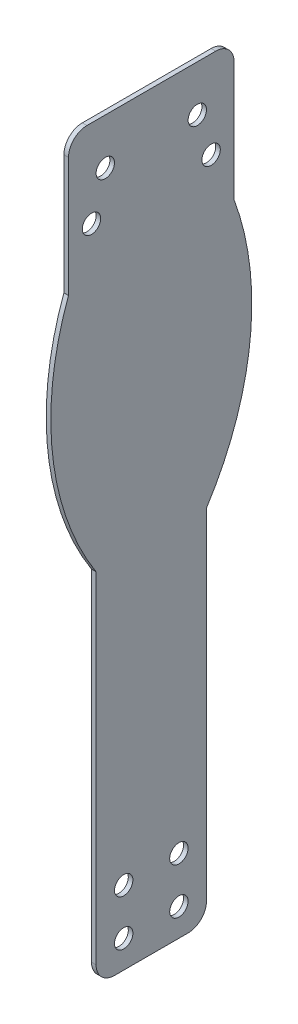
ISO-10303-21;
HEADER;
FILE_DESCRIPTION(('STEP AP214'),'2;1');
FILE_NAME('part.step','',(''),(''),'','','');
FILE_SCHEMA(('AUTOMOTIVE_DESIGN { 1 0 10303 214 1 1 1 1 }'));
ENDSEC;
DATA;
#1=APPLICATION_CONTEXT('core data for automotive mechanical design processes');
#2=APPLICATION_PROTOCOL_DEFINITION('international standard','automotive_design',2000,#1);
#3=PRODUCT_CONTEXT('',#1,'mechanical');
#4=PRODUCT('Part','Part','',(#3));
#5=PRODUCT_RELATED_PRODUCT_CATEGORY('part','',(#4));
#6=PRODUCT_DEFINITION_FORMATION('','',#4);
#7=PRODUCT_DEFINITION_CONTEXT('part definition',#1,'design');
#8=PRODUCT_DEFINITION('design','',#6,#7);
#9=PRODUCT_DEFINITION_SHAPE('','',#8);
#10=(LENGTH_UNIT() NAMED_UNIT(*) SI_UNIT(.MILLI.,.METRE.));
#11=(NAMED_UNIT(*) PLANE_ANGLE_UNIT() SI_UNIT($,.RADIAN.));
#12=(NAMED_UNIT(*) SI_UNIT($,.STERADIAN.) SOLID_ANGLE_UNIT());
#13=UNCERTAINTY_MEASURE_WITH_UNIT(LENGTH_MEASURE(1.E-05),#10,'distance_accuracy_value','');
#14=(GEOMETRIC_REPRESENTATION_CONTEXT(3) GLOBAL_UNCERTAINTY_ASSIGNED_CONTEXT((#13)) GLOBAL_UNIT_ASSIGNED_CONTEXT((#10,
#11,#12)) REPRESENTATION_CONTEXT('',''));
#15=CARTESIAN_POINT('',(0.,0.,0.));
#16=DIRECTION('',(0.,0.,1.));
#17=DIRECTION('',(1.,0.,0.));
#18=AXIS2_PLACEMENT_3D('',#15,#16,#17);
#19=CARTESIAN_POINT('',(1.,0.,18.));
#20=DIRECTION('',(0.,0.,-1.));
#21=DIRECTION('',(0.,1.,0.));
#22=AXIS2_PLACEMENT_3D('',#19,#20,#21);
#23=PLANE('',#22);
#24=DIRECTION('',(0.,-1.,0.));
#25=VECTOR('',#24,1.);
#26=CARTESIAN_POINT('',(1.,0.,18.));
#27=LINE('',#26,#25);
#28=CARTESIAN_POINT('',(1.,-3.99999999999999,18.));
#29=VERTEX_POINT('',#28);
#30=CARTESIAN_POINT('',(1.,-30.,18.));
#31=VERTEX_POINT('',#30);
#32=EDGE_CURVE('E125',#29,#31,#27,.T.);
#33=ORIENTED_EDGE('',*,*,#32,.F.);
#34=DIRECTION('',(-1.,0.,0.));
#35=VECTOR('',#34,1.);
#36=CARTESIAN_POINT('',(0.,-3.99999999999999,18.));
#37=LINE('',#36,#35);
#38=CARTESIAN_POINT('',(0.,-3.99999999999999,18.));
#39=VERTEX_POINT('',#38);
#40=EDGE_CURVE('E152',#29,#39,#37,.T.);
#41=ORIENTED_EDGE('',*,*,#40,.T.);
#42=DIRECTION('',(0.,-1.,0.));
#43=VECTOR('',#42,1.);
#44=CARTESIAN_POINT('',(0.,0.,18.));
#45=LINE('',#44,#43);
#46=CARTESIAN_POINT('',(0.,-30.,18.));
#47=VERTEX_POINT('',#46);
#48=EDGE_CURVE('E150',#39,#47,#45,.T.);
#49=ORIENTED_EDGE('',*,*,#48,.T.);
#50=DIRECTION('',(-1.,0.,0.));
#51=VECTOR('',#50,1.);
#52=CARTESIAN_POINT('',(1.,-30.,18.));
#53=LINE('',#52,#51);
#54=EDGE_CURVE('E144',#31,#47,#53,.T.);
#55=ORIENTED_EDGE('',*,*,#54,.F.);
#56=EDGE_LOOP('',(#33,#41,#49,#55));
#57=FACE_BOUND('',#56,.T.);
#58=ADVANCED_FACE('F36',(#57),#23,.F.);
#59=CARTESIAN_POINT('',(1.,-51.4826288706178,-40.1592353526703));
#60=DIRECTION('',(-1.,0.,0.));
#61=DIRECTION('',(0.,0.,1.));
#62=AXIS2_PLACEMENT_3D('',#59,#60,#61);
#63=CYLINDRICAL_SURFACE('',#62,62.);
#64=CARTESIAN_POINT('',(0.,-51.4826288706178,-40.1592353526703));
#65=DIRECTION('',(1.,0.,0.));
#66=DIRECTION('',(0.,0.,-1.));
#67=AXIS2_PLACEMENT_3D('',#64,#65,#66);
#68=CIRCLE('',#67,62.);
#69=CARTESIAN_POINT('',(0.,-85.,12.));
#70=VERTEX_POINT('',#69);
#71=EDGE_CURVE('E237',#47,#70,#68,.T.);
#72=ORIENTED_EDGE('',*,*,#71,.T.);
#73=DIRECTION('',(-1.,0.,0.));
#74=VECTOR('',#73,1.);
#75=CARTESIAN_POINT('',(1.,-85.,12.));
#76=LINE('',#75,#74);
#77=CARTESIAN_POINT('',(1.,-85.,12.));
#78=VERTEX_POINT('',#77);
#79=EDGE_CURVE('E146',#78,#70,#76,.T.);
#80=ORIENTED_EDGE('',*,*,#79,.F.);
#81=CARTESIAN_POINT('',(1.,-51.4826288706178,-40.1592353526703));
#82=DIRECTION('',(1.,0.,0.));
#83=DIRECTION('',(0.,0.,-1.));
#84=AXIS2_PLACEMENT_3D('',#81,#82,#83);
#85=CIRCLE('',#84,62.);
#86=EDGE_CURVE('E130',#31,#78,#85,.T.);
#87=ORIENTED_EDGE('',*,*,#86,.F.);
#88=ORIENTED_EDGE('',*,*,#54,.T.);
#89=EDGE_LOOP('',(#72,#80,#87,#88));
#90=FACE_BOUND('',#89,.T.);
#91=ADVANCED_FACE('F143',(#90),#63,.T.);
#92=CARTESIAN_POINT('',(1.,-163.,12.));
#93=DIRECTION('',(0.,0.,1.));
#94=DIRECTION('',(1.,0.,0.));
#95=AXIS2_PLACEMENT_3D('',#92,#93,#94);
#96=PLANE('',#95);
#97=DIRECTION('',(0.,1.,0.));
#98=VECTOR('',#97,1.);
#99=CARTESIAN_POINT('',(0.,-163.,12.));
#100=LINE('',#99,#98);
#101=CARTESIAN_POINT('',(0.,-159.,12.));
#102=VERTEX_POINT('',#101);
#103=EDGE_CURVE('E213',#102,#70,#100,.T.);
#104=ORIENTED_EDGE('',*,*,#103,.F.);
#105=DIRECTION('',(-1.,0.,0.));
#106=VECTOR('',#105,1.);
#107=CARTESIAN_POINT('',(1.,-159.,12.));
#108=LINE('',#107,#106);
#109=CARTESIAN_POINT('',(1.,-159.,12.));
#110=VERTEX_POINT('',#109);
#111=EDGE_CURVE('E11',#102,#110,#108,.F.);
#112=ORIENTED_EDGE('',*,*,#111,.T.);
#113=DIRECTION('',(0.,1.,0.));
#114=VECTOR('',#113,1.);
#115=CARTESIAN_POINT('',(1.,-163.,12.));
#116=LINE('',#115,#114);
#117=EDGE_CURVE('E147',#110,#78,#116,.T.);
#118=ORIENTED_EDGE('',*,*,#117,.T.);
#119=ORIENTED_EDGE('',*,*,#79,.T.);
#120=EDGE_LOOP('',(#104,#112,#118,#119));
#121=FACE_BOUND('',#120,.T.);
#122=ADVANCED_FACE('F242',(#121),#96,.T.);
#123=CARTESIAN_POINT('',(1.,-163.,-12.));
#124=DIRECTION('',(0.,-1.,0.));
#125=DIRECTION('',(0.,0.,-1.));
#126=AXIS2_PLACEMENT_3D('',#123,#124,#125);
#127=PLANE('',#126);
#128=DIRECTION('',(0.,0.,1.));
#129=VECTOR('',#128,1.);
#130=CARTESIAN_POINT('',(0.,-163.,-12.));
#131=LINE('',#130,#129);
#132=CARTESIAN_POINT('',(0.,-163.,-8.));
#133=VERTEX_POINT('',#132);
#134=CARTESIAN_POINT('',(0.,-163.,8.));
#135=VERTEX_POINT('',#134);
#136=EDGE_CURVE('E192',#133,#135,#131,.T.);
#137=ORIENTED_EDGE('',*,*,#136,.F.);
#138=DIRECTION('',(-1.,0.,0.));
#139=VECTOR('',#138,1.);
#140=CARTESIAN_POINT('',(1.,-163.,-8.));
#141=LINE('',#140,#139);
#142=CARTESIAN_POINT('',(1.,-163.,-8.));
#143=VERTEX_POINT('',#142);
#144=EDGE_CURVE('E44',#133,#143,#141,.F.);
#145=ORIENTED_EDGE('',*,*,#144,.T.);
#146=DIRECTION('',(0.,0.,1.));
#147=VECTOR('',#146,1.);
#148=CARTESIAN_POINT('',(1.,-163.,-12.));
#149=LINE('',#148,#147);
#150=CARTESIAN_POINT('',(1.,-163.,8.));
#151=VERTEX_POINT('',#150);
#152=EDGE_CURVE('E189',#143,#151,#149,.T.);
#153=ORIENTED_EDGE('',*,*,#152,.T.);
#154=DIRECTION('',(-1.,0.,0.));
#155=VECTOR('',#154,1.);
#156=CARTESIAN_POINT('',(1.,-163.,8.));
#157=LINE('',#156,#155);
#158=EDGE_CURVE('E182',#151,#135,#157,.T.);
#159=ORIENTED_EDGE('',*,*,#158,.T.);
#160=EDGE_LOOP('',(#137,#145,#153,#159));
#161=FACE_BOUND('',#160,.T.);
#162=ADVANCED_FACE('F188',(#161),#127,.T.);
#163=CARTESIAN_POINT('',(1.,-163.,-12.));
#164=DIRECTION('',(0.,0.,1.));
#165=DIRECTION('',(1.,0.,0.));
#166=AXIS2_PLACEMENT_3D('',#163,#164,#165);
#167=PLANE('',#166);
#168=DIRECTION('',(0.,1.,0.));
#169=VECTOR('',#168,1.);
#170=CARTESIAN_POINT('',(1.,-163.,-12.));
#171=LINE('',#170,#169);
#172=CARTESIAN_POINT('',(1.,-159.,-12.));
#173=VERTEX_POINT('',#172);
#174=CARTESIAN_POINT('',(1.,-85.,-12.));
#175=VERTEX_POINT('',#174);
#176=EDGE_CURVE('E195',#173,#175,#171,.T.);
#177=ORIENTED_EDGE('',*,*,#176,.F.);
#178=DIRECTION('',(-1.,0.,0.));
#179=VECTOR('',#178,1.);
#180=CARTESIAN_POINT('',(0.,-159.,-12.));
#181=LINE('',#180,#179);
#182=CARTESIAN_POINT('',(0.,-159.,-12.));
#183=VERTEX_POINT('',#182);
#184=EDGE_CURVE('E179',#173,#183,#181,.T.);
#185=ORIENTED_EDGE('',*,*,#184,.T.);
#186=DIRECTION('',(0.,1.,0.));
#187=VECTOR('',#186,1.);
#188=CARTESIAN_POINT('',(0.,-163.,-12.));
#189=LINE('',#188,#187);
#190=CARTESIAN_POINT('',(0.,-85.,-12.));
#191=VERTEX_POINT('',#190);
#192=EDGE_CURVE('E203',#183,#191,#189,.T.);
#193=ORIENTED_EDGE('',*,*,#192,.T.);
#194=DIRECTION('',(-1.,0.,0.));
#195=VECTOR('',#194,1.);
#196=CARTESIAN_POINT('',(1.,-85.,-12.));
#197=LINE('',#196,#195);
#198=EDGE_CURVE('E156',#175,#191,#197,.T.);
#199=ORIENTED_EDGE('',*,*,#198,.F.);
#200=EDGE_LOOP('',(#177,#185,#193,#199));
#201=FACE_BOUND('',#200,.T.);
#202=ADVANCED_FACE('F201',(#201),#167,.F.);
#203=CARTESIAN_POINT('',(1.,-51.4826288706178,40.1592353526703));
#204=DIRECTION('',(-1.,0.,0.));
#205=DIRECTION('',(0.,0.,1.));
#206=AXIS2_PLACEMENT_3D('',#203,#204,#205);
#207=CYLINDRICAL_SURFACE('',#206,62.);
#208=CARTESIAN_POINT('',(0.,-51.4826288706178,40.1592353526703));
#209=DIRECTION('',(-1.,0.,0.));
#210=DIRECTION('',(0.,0.,1.));
#211=AXIS2_PLACEMENT_3D('',#208,#209,#210);
#212=CIRCLE('',#211,62.);
#213=CARTESIAN_POINT('',(0.,-30.,-18.));
#214=VERTEX_POINT('',#213);
#215=EDGE_CURVE('E209',#214,#191,#212,.T.);
#216=ORIENTED_EDGE('',*,*,#215,.F.);
#217=DIRECTION('',(-1.,0.,0.));
#218=VECTOR('',#217,1.);
#219=CARTESIAN_POINT('',(1.,-30.,-18.));
#220=LINE('',#219,#218);
#221=CARTESIAN_POINT('',(1.,-30.,-18.));
#222=VERTEX_POINT('',#221);
#223=EDGE_CURVE('E220',#222,#214,#220,.T.);
#224=ORIENTED_EDGE('',*,*,#223,.F.);
#225=CARTESIAN_POINT('',(1.,-51.4826288706178,40.1592353526703));
#226=DIRECTION('',(-1.,0.,0.));
#227=DIRECTION('',(0.,0.,1.));
#228=AXIS2_PLACEMENT_3D('',#225,#226,#227);
#229=CIRCLE('',#228,62.);
#230=EDGE_CURVE('E228',#222,#175,#229,.T.);
#231=ORIENTED_EDGE('',*,*,#230,.T.);
#232=ORIENTED_EDGE('',*,*,#198,.T.);
#233=EDGE_LOOP('',(#216,#224,#231,#232));
#234=FACE_BOUND('',#233,.T.);
#235=ADVANCED_FACE('F225',(#234),#207,.T.);
#236=CARTESIAN_POINT('',(1.,0.,-18.));
#237=DIRECTION('',(0.,0.,-1.));
#238=DIRECTION('',(0.,1.,0.));
#239=AXIS2_PLACEMENT_3D('',#236,#237,#238);
#240=PLANE('',#239);
#241=DIRECTION('',(0.,-1.,0.));
#242=VECTOR('',#241,1.);
#243=CARTESIAN_POINT('',(0.,0.,-18.));
#244=LINE('',#243,#242);
#245=CARTESIAN_POINT('',(0.,-4.,-18.));
#246=VERTEX_POINT('',#245);
#247=EDGE_CURVE('E211',#246,#214,#244,.T.);
#248=ORIENTED_EDGE('',*,*,#247,.F.);
#249=DIRECTION('',(-1.,0.,0.));
#250=VECTOR('',#249,1.);
#251=CARTESIAN_POINT('',(1.,-4.,-18.));
#252=LINE('',#251,#250);
#253=CARTESIAN_POINT('',(1.,-4.,-18.));
#254=VERTEX_POINT('',#253);
#255=EDGE_CURVE('E51',#246,#254,#252,.F.);
#256=ORIENTED_EDGE('',*,*,#255,.T.);
#257=DIRECTION('',(0.,-1.,0.));
#258=VECTOR('',#257,1.);
#259=CARTESIAN_POINT('',(1.,0.,-18.));
#260=LINE('',#259,#258);
#261=EDGE_CURVE('E229',#254,#222,#260,.T.);
#262=ORIENTED_EDGE('',*,*,#261,.T.);
#263=ORIENTED_EDGE('',*,*,#223,.T.);
#264=EDGE_LOOP('',(#248,#256,#262,#263));
#265=FACE_BOUND('',#264,.T.);
#266=ADVANCED_FACE('F391',(#265),#240,.T.);
#267=CARTESIAN_POINT('',(1.,0.,18.));
#268=DIRECTION('',(0.,1.,0.));
#269=DIRECTION('',(0.,0.,1.));
#270=AXIS2_PLACEMENT_3D('',#267,#268,#269);
#271=PLANE('',#270);
#272=DIRECTION('',(0.,0.,-1.));
#273=VECTOR('',#272,1.);
#274=CARTESIAN_POINT('',(0.,0.,18.));
#275=LINE('',#274,#273);
#276=CARTESIAN_POINT('',(0.,0.,14.));
#277=VERTEX_POINT('',#276);
#278=CARTESIAN_POINT('',(0.,0.,-14.));
#279=VERTEX_POINT('',#278);
#280=EDGE_CURVE('E138',#277,#279,#275,.T.);
#281=ORIENTED_EDGE('',*,*,#280,.F.);
#282=DIRECTION('',(-1.,0.,0.));
#283=VECTOR('',#282,1.);
#284=CARTESIAN_POINT('',(1.,0.,14.));
#285=LINE('',#284,#283);
#286=CARTESIAN_POINT('',(1.,0.,14.));
#287=VERTEX_POINT('',#286);
#288=EDGE_CURVE('E170',#277,#287,#285,.F.);
#289=ORIENTED_EDGE('',*,*,#288,.T.);
#290=DIRECTION('',(0.,0.,-1.));
#291=VECTOR('',#290,1.);
#292=CARTESIAN_POINT('',(1.,0.,18.));
#293=LINE('',#292,#291);
#294=CARTESIAN_POINT('',(1.,0.,-14.));
#295=VERTEX_POINT('',#294);
#296=EDGE_CURVE('E222',#287,#295,#293,.T.);
#297=ORIENTED_EDGE('',*,*,#296,.T.);
#298=DIRECTION('',(-1.,0.,0.));
#299=VECTOR('',#298,1.);
#300=CARTESIAN_POINT('',(1.,0.,-14.));
#301=LINE('',#300,#299);
#302=EDGE_CURVE('E167',#295,#279,#301,.T.);
#303=ORIENTED_EDGE('',*,*,#302,.T.);
#304=EDGE_LOOP('',(#281,#289,#297,#303));
#305=FACE_BOUND('',#304,.T.);
#306=ADVANCED_FACE('F305',(#305),#271,.T.);
#307=CARTESIAN_POINT('',(1.,-51.4826288706178,-40.1592353526703));
#308=DIRECTION('',(1.,0.,0.));
#309=DIRECTION('',(0.,0.,-1.));
#310=AXIS2_PLACEMENT_3D('',#307,#308,#309);
#311=PLANE('',#310);
#312=CARTESIAN_POINT('',(1.,-147.,-6.00000000000002));
#313=DIRECTION('',(1.,0.,0.));
#314=DIRECTION('',(0.,0.,-1.));
#315=AXIS2_PLACEMENT_3D('',#312,#313,#314);
#316=CIRCLE('',#315,2.);
#317=CARTESIAN_POINT('',(1.,-147.,-8.00000000000002));
#318=VERTEX_POINT('',#317);
#319=EDGE_CURVE('E286',#318,#318,#316,.T.);
#320=ORIENTED_EDGE('',*,*,#319,.F.);
#321=EDGE_LOOP('',(#320));
#322=FACE_BOUND('',#321,.T.);
#323=CARTESIAN_POINT('',(1.,-147.,5.99999999999998));
#324=DIRECTION('',(1.,0.,0.));
#325=DIRECTION('',(0.,0.,-1.));
#326=AXIS2_PLACEMENT_3D('',#323,#324,#325);
#327=CIRCLE('',#326,2.);
#328=CARTESIAN_POINT('',(1.,-147.,3.99999999999998));
#329=VERTEX_POINT('',#328);
#330=EDGE_CURVE('E280',#329,#329,#327,.T.);
#331=ORIENTED_EDGE('',*,*,#330,.F.);
#332=EDGE_LOOP('',(#331));
#333=FACE_BOUND('',#332,.T.);
#334=CARTESIAN_POINT('',(1.,-157.,5.99999999999998));
#335=DIRECTION('',(1.,0.,0.));
#336=DIRECTION('',(0.,0.,-1.));
#337=AXIS2_PLACEMENT_3D('',#334,#335,#336);
#338=CIRCLE('',#337,2.);
#339=CARTESIAN_POINT('',(1.,-157.,3.99999999999998));
#340=VERTEX_POINT('',#339);
#341=EDGE_CURVE('E277',#340,#340,#338,.T.);
#342=ORIENTED_EDGE('',*,*,#341,.F.);
#343=EDGE_LOOP('',(#342));
#344=FACE_BOUND('',#343,.T.);
#345=CARTESIAN_POINT('',(1.,-157.,-6.00000000000002));
#346=DIRECTION('',(1.,0.,0.));
#347=DIRECTION('',(0.,0.,-1.));
#348=AXIS2_PLACEMENT_3D('',#345,#346,#347);
#349=CIRCLE('',#348,2.);
#350=CARTESIAN_POINT('',(1.,-157.,-8.00000000000002));
#351=VERTEX_POINT('',#350);
#352=EDGE_CURVE('E271',#351,#351,#349,.T.);
#353=ORIENTED_EDGE('',*,*,#352,.F.);
#354=EDGE_LOOP('',(#353));
#355=FACE_BOUND('',#354,.T.);
#356=CARTESIAN_POINT('',(1.,-19.,-13.));
#357=DIRECTION('',(-1.,0.,0.));
#358=DIRECTION('',(0.,0.,1.));
#359=AXIS2_PLACEMENT_3D('',#356,#357,#358);
#360=CIRCLE('',#359,2.);
#361=CARTESIAN_POINT('',(1.,-19.,-11.));
#362=VERTEX_POINT('',#361);
#363=EDGE_CURVE('E262',#362,#362,#360,.T.);
#364=ORIENTED_EDGE('',*,*,#363,.T.);
#365=EDGE_LOOP('',(#364));
#366=FACE_BOUND('',#365,.T.);
#367=CARTESIAN_POINT('',(1.,-19.,13.));
#368=DIRECTION('',(-1.,0.,0.));
#369=DIRECTION('',(0.,0.,1.));
#370=AXIS2_PLACEMENT_3D('',#367,#368,#369);
#371=CIRCLE('',#370,2.);
#372=CARTESIAN_POINT('',(1.,-19.,15.));
#373=VERTEX_POINT('',#372);
#374=EDGE_CURVE('E256',#373,#373,#371,.T.);
#375=ORIENTED_EDGE('',*,*,#374,.T.);
#376=EDGE_LOOP('',(#375));
#377=FACE_BOUND('',#376,.T.);
#378=CARTESIAN_POINT('',(1.,-10.,10.));
#379=DIRECTION('',(-1.,0.,0.));
#380=DIRECTION('',(0.,0.,1.));
#381=AXIS2_PLACEMENT_3D('',#378,#379,#380);
#382=CIRCLE('',#381,2.);
#383=CARTESIAN_POINT('',(1.,-10.,12.));
#384=VERTEX_POINT('',#383);
#385=EDGE_CURVE('E250',#384,#384,#382,.T.);
#386=ORIENTED_EDGE('',*,*,#385,.T.);
#387=EDGE_LOOP('',(#386));
#388=FACE_BOUND('',#387,.T.);
#389=CARTESIAN_POINT('',(1.,-10.,-10.));
#390=DIRECTION('',(-1.,0.,0.));
#391=DIRECTION('',(0.,0.,1.));
#392=AXIS2_PLACEMENT_3D('',#389,#390,#391);
#393=CIRCLE('',#392,2.);
#394=CARTESIAN_POINT('',(1.,-10.,-8.));
#395=VERTEX_POINT('',#394);
#396=EDGE_CURVE('E238',#395,#395,#393,.T.);
#397=ORIENTED_EDGE('',*,*,#396,.T.);
#398=EDGE_LOOP('',(#397));
#399=FACE_BOUND('',#398,.T.);
#400=ORIENTED_EDGE('',*,*,#296,.F.);
#401=CARTESIAN_POINT('',(1.,-4.,14.));
#402=DIRECTION('',(1.,0.,0.));
#403=DIRECTION('',(0.,0.,-1.));
#404=AXIS2_PLACEMENT_3D('',#401,#402,#403);
#405=CIRCLE('',#404,4.);
#406=EDGE_CURVE('E133',#287,#29,#405,.T.);
#407=ORIENTED_EDGE('',*,*,#406,.T.);
#408=ORIENTED_EDGE('',*,*,#32,.T.);
#409=ORIENTED_EDGE('',*,*,#86,.T.);
#410=ORIENTED_EDGE('',*,*,#117,.F.);
#411=CARTESIAN_POINT('',(1.,-159.,8.));
#412=DIRECTION('',(1.,0.,0.));
#413=DIRECTION('',(0.,0.,-1.));
#414=AXIS2_PLACEMENT_3D('',#411,#412,#413);
#415=CIRCLE('',#414,4.);
#416=EDGE_CURVE('E172',#110,#151,#415,.T.);
#417=ORIENTED_EDGE('',*,*,#416,.T.);
#418=ORIENTED_EDGE('',*,*,#152,.F.);
#419=CARTESIAN_POINT('',(1.,-159.,-8.));
#420=DIRECTION('',(1.,0.,0.));
#421=DIRECTION('',(0.,0.,-1.));
#422=AXIS2_PLACEMENT_3D('',#419,#420,#421);
#423=CIRCLE('',#422,4.);
#424=EDGE_CURVE('E59',#143,#173,#423,.T.);
#425=ORIENTED_EDGE('',*,*,#424,.T.);
#426=ORIENTED_EDGE('',*,*,#176,.T.);
#427=ORIENTED_EDGE('',*,*,#230,.F.);
#428=ORIENTED_EDGE('',*,*,#261,.F.);
#429=CARTESIAN_POINT('',(1.,-3.99999999999999,-14.));
#430=DIRECTION('',(1.,0.,0.));
#431=DIRECTION('',(0.,0.,-1.));
#432=AXIS2_PLACEMENT_3D('',#429,#430,#431);
#433=CIRCLE('',#432,4.);
#434=EDGE_CURVE('E175',#254,#295,#433,.T.);
#435=ORIENTED_EDGE('',*,*,#434,.T.);
#436=EDGE_LOOP('',(#400,#407,#408,#409,#410,#417,#418,#425,#426,#427,#428,#435));
#437=FACE_BOUND('',#436,.T.);
#438=ADVANCED_FACE('F128',(#322,#333,#344,#355,#366,#377,#388,#399,#437),#311,.T.);
#439=CARTESIAN_POINT('',(0.,-51.4826288706178,-40.1592353526703));
#440=DIRECTION('',(1.,0.,0.));
#441=DIRECTION('',(0.,0.,-1.));
#442=AXIS2_PLACEMENT_3D('',#439,#440,#441);
#443=PLANE('',#442);
#444=CARTESIAN_POINT('',(0.,-147.,-6.00000000000002));
#445=DIRECTION('',(1.,0.,0.));
#446=DIRECTION('',(0.,0.,-1.));
#447=AXIS2_PLACEMENT_3D('',#444,#445,#446);
#448=CIRCLE('',#447,2.);
#449=CARTESIAN_POINT('',(0.,-147.,-8.00000000000002));
#450=VERTEX_POINT('',#449);
#451=EDGE_CURVE('E289',#450,#450,#448,.T.);
#452=ORIENTED_EDGE('',*,*,#451,.T.);
#453=EDGE_LOOP('',(#452));
#454=FACE_BOUND('',#453,.T.);
#455=CARTESIAN_POINT('',(0.,-147.,5.99999999999998));
#456=DIRECTION('',(1.,0.,0.));
#457=DIRECTION('',(0.,0.,-1.));
#458=AXIS2_PLACEMENT_3D('',#455,#456,#457);
#459=CIRCLE('',#458,2.);
#460=CARTESIAN_POINT('',(0.,-147.,3.99999999999998));
#461=VERTEX_POINT('',#460);
#462=EDGE_CURVE('E283',#461,#461,#459,.T.);
#463=ORIENTED_EDGE('',*,*,#462,.T.);
#464=EDGE_LOOP('',(#463));
#465=FACE_BOUND('',#464,.T.);
#466=CARTESIAN_POINT('',(0.,-157.,5.99999999999998));
#467=DIRECTION('',(1.,0.,0.));
#468=DIRECTION('',(0.,0.,-1.));
#469=AXIS2_PLACEMENT_3D('',#466,#467,#468);
#470=CIRCLE('',#469,2.);
#471=CARTESIAN_POINT('',(0.,-157.,3.99999999999998));
#472=VERTEX_POINT('',#471);
#473=EDGE_CURVE('E274',#472,#472,#470,.T.);
#474=ORIENTED_EDGE('',*,*,#473,.T.);
#475=EDGE_LOOP('',(#474));
#476=FACE_BOUND('',#475,.T.);
#477=CARTESIAN_POINT('',(0.,-157.,-6.00000000000002));
#478=DIRECTION('',(1.,0.,0.));
#479=DIRECTION('',(0.,0.,-1.));
#480=AXIS2_PLACEMENT_3D('',#477,#478,#479);
#481=CIRCLE('',#480,2.);
#482=CARTESIAN_POINT('',(0.,-157.,-8.00000000000002));
#483=VERTEX_POINT('',#482);
#484=EDGE_CURVE('E268',#483,#483,#481,.T.);
#485=ORIENTED_EDGE('',*,*,#484,.T.);
#486=EDGE_LOOP('',(#485));
#487=FACE_BOUND('',#486,.T.);
#488=CARTESIAN_POINT('',(0.,-19.,-13.));
#489=DIRECTION('',(-1.,0.,0.));
#490=DIRECTION('',(0.,0.,1.));
#491=AXIS2_PLACEMENT_3D('',#488,#489,#490);
#492=CIRCLE('',#491,2.);
#493=CARTESIAN_POINT('',(0.,-19.,-11.));
#494=VERTEX_POINT('',#493);
#495=EDGE_CURVE('E265',#494,#494,#492,.T.);
#496=ORIENTED_EDGE('',*,*,#495,.F.);
#497=EDGE_LOOP('',(#496));
#498=FACE_BOUND('',#497,.T.);
#499=CARTESIAN_POINT('',(0.,-19.,13.));
#500=DIRECTION('',(-1.,0.,0.));
#501=DIRECTION('',(0.,0.,1.));
#502=AXIS2_PLACEMENT_3D('',#499,#500,#501);
#503=CIRCLE('',#502,2.);
#504=CARTESIAN_POINT('',(0.,-19.,15.));
#505=VERTEX_POINT('',#504);
#506=EDGE_CURVE('E259',#505,#505,#503,.T.);
#507=ORIENTED_EDGE('',*,*,#506,.F.);
#508=EDGE_LOOP('',(#507));
#509=FACE_BOUND('',#508,.T.);
#510=CARTESIAN_POINT('',(0.,-10.,10.));
#511=DIRECTION('',(-1.,0.,0.));
#512=DIRECTION('',(0.,0.,1.));
#513=AXIS2_PLACEMENT_3D('',#510,#511,#512);
#514=CIRCLE('',#513,2.);
#515=CARTESIAN_POINT('',(0.,-10.,12.));
#516=VERTEX_POINT('',#515);
#517=EDGE_CURVE('E253',#516,#516,#514,.T.);
#518=ORIENTED_EDGE('',*,*,#517,.F.);
#519=EDGE_LOOP('',(#518));
#520=FACE_BOUND('',#519,.T.);
#521=CARTESIAN_POINT('',(0.,-10.,-10.));
#522=DIRECTION('',(-1.,0.,0.));
#523=DIRECTION('',(0.,0.,1.));
#524=AXIS2_PLACEMENT_3D('',#521,#522,#523);
#525=CIRCLE('',#524,2.);
#526=CARTESIAN_POINT('',(0.,-10.,-8.));
#527=VERTEX_POINT('',#526);
#528=EDGE_CURVE('E247',#527,#527,#525,.T.);
#529=ORIENTED_EDGE('',*,*,#528,.F.);
#530=EDGE_LOOP('',(#529));
#531=FACE_BOUND('',#530,.T.);
#532=ORIENTED_EDGE('',*,*,#48,.F.);
#533=CARTESIAN_POINT('',(0.,-4.,14.));
#534=DIRECTION('',(1.,0.,0.));
#535=DIRECTION('',(0.,0.,-1.));
#536=AXIS2_PLACEMENT_3D('',#533,#534,#535);
#537=CIRCLE('',#536,4.);
#538=EDGE_CURVE('E165',#39,#277,#537,.F.);
#539=ORIENTED_EDGE('',*,*,#538,.T.);
#540=ORIENTED_EDGE('',*,*,#280,.T.);
#541=CARTESIAN_POINT('',(0.,-3.99999999999999,-14.));
#542=DIRECTION('',(1.,0.,0.));
#543=DIRECTION('',(0.,0.,-1.));
#544=AXIS2_PLACEMENT_3D('',#541,#542,#543);
#545=CIRCLE('',#544,4.);
#546=EDGE_CURVE('E163',#279,#246,#545,.F.);
#547=ORIENTED_EDGE('',*,*,#546,.T.);
#548=ORIENTED_EDGE('',*,*,#247,.T.);
#549=ORIENTED_EDGE('',*,*,#215,.T.);
#550=ORIENTED_EDGE('',*,*,#192,.F.);
#551=CARTESIAN_POINT('',(0.,-159.,-8.));
#552=DIRECTION('',(1.,0.,0.));
#553=DIRECTION('',(0.,0.,-1.));
#554=AXIS2_PLACEMENT_3D('',#551,#552,#553);
#555=CIRCLE('',#554,4.);
#556=EDGE_CURVE('E161',#183,#133,#555,.F.);
#557=ORIENTED_EDGE('',*,*,#556,.T.);
#558=ORIENTED_EDGE('',*,*,#136,.T.);
#559=CARTESIAN_POINT('',(0.,-159.,8.));
#560=DIRECTION('',(1.,0.,0.));
#561=DIRECTION('',(0.,0.,-1.));
#562=AXIS2_PLACEMENT_3D('',#559,#560,#561);
#563=CIRCLE('',#562,4.);
#564=EDGE_CURVE('E154',#135,#102,#563,.F.);
#565=ORIENTED_EDGE('',*,*,#564,.T.);
#566=ORIENTED_EDGE('',*,*,#103,.T.);
#567=ORIENTED_EDGE('',*,*,#71,.F.);
#568=EDGE_LOOP('',(#532,#539,#540,#547,#548,#549,#550,#557,#558,#565,#566,#567));
#569=FACE_BOUND('',#568,.T.);
#570=ADVANCED_FACE('F207',(#454,#465,#476,#487,#498,#509,#520,#531,#569),#443,.F.);
#571=CARTESIAN_POINT('',(0.,-10.,-10.));
#572=DIRECTION('',(-1.,0.,0.));
#573=DIRECTION('',(0.,0.,1.));
#574=AXIS2_PLACEMENT_3D('',#571,#572,#573);
#575=CYLINDRICAL_SURFACE('',#574,2.);
#576=ORIENTED_EDGE('',*,*,#396,.F.);
#577=EDGE_LOOP('',(#576));
#578=FACE_BOUND('',#577,.T.);
#579=ORIENTED_EDGE('',*,*,#528,.T.);
#580=EDGE_LOOP('',(#579));
#581=FACE_BOUND('',#580,.T.);
#582=ADVANCED_FACE('F321',(#578,#581),#575,.F.);
#583=CARTESIAN_POINT('',(0.,-10.,10.));
#584=DIRECTION('',(-1.,0.,0.));
#585=DIRECTION('',(0.,0.,1.));
#586=AXIS2_PLACEMENT_3D('',#583,#584,#585);
#587=CYLINDRICAL_SURFACE('',#586,2.);
#588=ORIENTED_EDGE('',*,*,#385,.F.);
#589=EDGE_LOOP('',(#588));
#590=FACE_BOUND('',#589,.T.);
#591=ORIENTED_EDGE('',*,*,#517,.T.);
#592=EDGE_LOOP('',(#591));
#593=FACE_BOUND('',#592,.T.);
#594=ADVANCED_FACE('F324',(#590,#593),#587,.F.);
#595=CARTESIAN_POINT('',(0.,-19.,13.));
#596=DIRECTION('',(-1.,0.,0.));
#597=DIRECTION('',(0.,0.,1.));
#598=AXIS2_PLACEMENT_3D('',#595,#596,#597);
#599=CYLINDRICAL_SURFACE('',#598,2.);
#600=ORIENTED_EDGE('',*,*,#374,.F.);
#601=EDGE_LOOP('',(#600));
#602=FACE_BOUND('',#601,.T.);
#603=ORIENTED_EDGE('',*,*,#506,.T.);
#604=EDGE_LOOP('',(#603));
#605=FACE_BOUND('',#604,.T.);
#606=ADVANCED_FACE('F473',(#602,#605),#599,.F.);
#607=CARTESIAN_POINT('',(0.,-19.,-13.));
#608=DIRECTION('',(-1.,0.,0.));
#609=DIRECTION('',(0.,0.,1.));
#610=AXIS2_PLACEMENT_3D('',#607,#608,#609);
#611=CYLINDRICAL_SURFACE('',#610,2.);
#612=ORIENTED_EDGE('',*,*,#363,.F.);
#613=EDGE_LOOP('',(#612));
#614=FACE_BOUND('',#613,.T.);
#615=ORIENTED_EDGE('',*,*,#495,.T.);
#616=EDGE_LOOP('',(#615));
#617=FACE_BOUND('',#616,.T.);
#618=ADVANCED_FACE('F463',(#614,#617),#611,.F.);
#619=CARTESIAN_POINT('',(1.,-157.,-6.00000000000002));
#620=DIRECTION('',(1.,0.,0.));
#621=DIRECTION('',(0.,0.,-1.));
#622=AXIS2_PLACEMENT_3D('',#619,#620,#621);
#623=CYLINDRICAL_SURFACE('',#622,2.);
#624=ORIENTED_EDGE('',*,*,#484,.F.);
#625=EDGE_LOOP('',(#624));
#626=FACE_BOUND('',#625,.T.);
#627=ORIENTED_EDGE('',*,*,#352,.T.);
#628=EDGE_LOOP('',(#627));
#629=FACE_BOUND('',#628,.T.);
#630=ADVANCED_FACE('F453',(#626,#629),#623,.F.);
#631=CARTESIAN_POINT('',(1.,-157.,5.99999999999998));
#632=DIRECTION('',(1.,0.,0.));
#633=DIRECTION('',(0.,0.,-1.));
#634=AXIS2_PLACEMENT_3D('',#631,#632,#633);
#635=CYLINDRICAL_SURFACE('',#634,2.);
#636=ORIENTED_EDGE('',*,*,#473,.F.);
#637=EDGE_LOOP('',(#636));
#638=FACE_BOUND('',#637,.T.);
#639=ORIENTED_EDGE('',*,*,#341,.T.);
#640=EDGE_LOOP('',(#639));
#641=FACE_BOUND('',#640,.T.);
#642=ADVANCED_FACE('F443',(#638,#641),#635,.F.);
#643=CARTESIAN_POINT('',(1.,-147.,5.99999999999998));
#644=DIRECTION('',(1.,0.,0.));
#645=DIRECTION('',(0.,0.,-1.));
#646=AXIS2_PLACEMENT_3D('',#643,#644,#645);
#647=CYLINDRICAL_SURFACE('',#646,2.);
#648=ORIENTED_EDGE('',*,*,#462,.F.);
#649=EDGE_LOOP('',(#648));
#650=FACE_BOUND('',#649,.T.);
#651=ORIENTED_EDGE('',*,*,#330,.T.);
#652=EDGE_LOOP('',(#651));
#653=FACE_BOUND('',#652,.T.);
#654=ADVANCED_FACE('F299',(#650,#653),#647,.F.);
#655=CARTESIAN_POINT('',(1.,-147.,-6.00000000000002));
#656=DIRECTION('',(1.,0.,0.));
#657=DIRECTION('',(0.,0.,-1.));
#658=AXIS2_PLACEMENT_3D('',#655,#656,#657);
#659=CYLINDRICAL_SURFACE('',#658,2.);
#660=ORIENTED_EDGE('',*,*,#451,.F.);
#661=EDGE_LOOP('',(#660));
#662=FACE_BOUND('',#661,.T.);
#663=ORIENTED_EDGE('',*,*,#319,.T.);
#664=EDGE_LOOP('',(#663));
#665=FACE_BOUND('',#664,.T.);
#666=ADVANCED_FACE('F295',(#662,#665),#659,.F.);
#667=CARTESIAN_POINT('',(1.,-4.,14.));
#668=DIRECTION('',(1.,0.,0.));
#669=DIRECTION('',(0.,0.,-1.));
#670=AXIS2_PLACEMENT_3D('',#667,#668,#669);
#671=CYLINDRICAL_SURFACE('',#670,4.);
#672=ORIENTED_EDGE('',*,*,#406,.F.);
#673=ORIENTED_EDGE('',*,*,#288,.F.);
#674=ORIENTED_EDGE('',*,*,#538,.F.);
#675=ORIENTED_EDGE('',*,*,#40,.F.);
#676=EDGE_LOOP('',(#672,#673,#674,#675));
#677=FACE_BOUND('',#676,.T.);
#678=ADVANCED_FACE('F298',(#677),#671,.T.);
#679=CARTESIAN_POINT('',(1.,-3.99999999999999,-14.));
#680=DIRECTION('',(-1.,0.,0.));
#681=DIRECTION('',(0.,0.,1.));
#682=AXIS2_PLACEMENT_3D('',#679,#680,#681);
#683=CYLINDRICAL_SURFACE('',#682,4.);
#684=ORIENTED_EDGE('',*,*,#434,.F.);
#685=ORIENTED_EDGE('',*,*,#255,.F.);
#686=ORIENTED_EDGE('',*,*,#546,.F.);
#687=ORIENTED_EDGE('',*,*,#302,.F.);
#688=EDGE_LOOP('',(#684,#685,#686,#687));
#689=FACE_BOUND('',#688,.T.);
#690=ADVANCED_FACE('F343',(#689),#683,.T.);
#691=CARTESIAN_POINT('',(1.,-159.,-8.));
#692=DIRECTION('',(1.,0.,0.));
#693=DIRECTION('',(0.,0.,-1.));
#694=AXIS2_PLACEMENT_3D('',#691,#692,#693);
#695=CYLINDRICAL_SURFACE('',#694,4.);
#696=ORIENTED_EDGE('',*,*,#424,.F.);
#697=ORIENTED_EDGE('',*,*,#144,.F.);
#698=ORIENTED_EDGE('',*,*,#556,.F.);
#699=ORIENTED_EDGE('',*,*,#184,.F.);
#700=EDGE_LOOP('',(#696,#697,#698,#699));
#701=FACE_BOUND('',#700,.T.);
#702=ADVANCED_FACE('F198',(#701),#695,.T.);
#703=CARTESIAN_POINT('',(1.,-159.,8.));
#704=DIRECTION('',(-1.,0.,0.));
#705=DIRECTION('',(0.,0.,1.));
#706=AXIS2_PLACEMENT_3D('',#703,#704,#705);
#707=CYLINDRICAL_SURFACE('',#706,4.);
#708=ORIENTED_EDGE('',*,*,#416,.F.);
#709=ORIENTED_EDGE('',*,*,#111,.F.);
#710=ORIENTED_EDGE('',*,*,#564,.F.);
#711=ORIENTED_EDGE('',*,*,#158,.F.);
#712=EDGE_LOOP('',(#708,#709,#710,#711));
#713=FACE_BOUND('',#712,.T.);
#714=ADVANCED_FACE('F38',(#713),#707,.T.);
#715=CLOSED_SHELL('',(#58,#91,#122,#162,#202,#235,#266,#306,#438,#570,#582,#594,#606,#618,#630,
#642,#654,#666,#678,#690,#702,#714));
#716=MANIFOLD_SOLID_BREP('B2',#715);
#717=ADVANCED_BREP_SHAPE_REPRESENTATION('',(#18,#716),#14);
#718=SHAPE_DEFINITION_REPRESENTATION(#9,#717);
ENDSEC;
END-ISO-10303-21;
